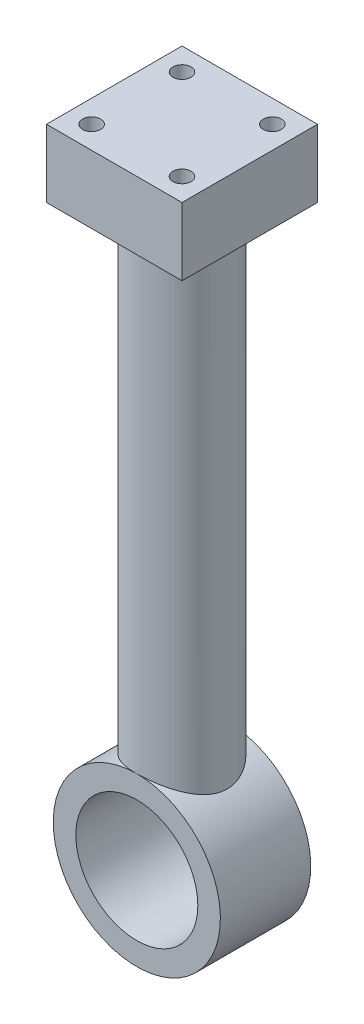
ISO-10303-21;
HEADER;
FILE_DESCRIPTION(('STEP AP214'),'2;1');
FILE_NAME('part.step','',(''),(''),'','','');
FILE_SCHEMA(('AUTOMOTIVE_DESIGN { 1 0 10303 214 1 1 1 1 }'));
ENDSEC;
DATA;
#1=APPLICATION_CONTEXT('core data for automotive mechanical design processes');
#2=APPLICATION_PROTOCOL_DEFINITION('international standard','automotive_design',2000,#1);
#3=PRODUCT_CONTEXT('',#1,'mechanical');
#4=PRODUCT('Part','Part','',(#3));
#5=PRODUCT_RELATED_PRODUCT_CATEGORY('part','',(#4));
#6=PRODUCT_DEFINITION_FORMATION('','',#4);
#7=PRODUCT_DEFINITION_CONTEXT('part definition',#1,'design');
#8=PRODUCT_DEFINITION('design','',#6,#7);
#9=PRODUCT_DEFINITION_SHAPE('','',#8);
#10=(LENGTH_UNIT() NAMED_UNIT(*) SI_UNIT(.MILLI.,.METRE.));
#11=(NAMED_UNIT(*) PLANE_ANGLE_UNIT() SI_UNIT($,.RADIAN.));
#12=(NAMED_UNIT(*) SI_UNIT($,.STERADIAN.) SOLID_ANGLE_UNIT());
#13=UNCERTAINTY_MEASURE_WITH_UNIT(LENGTH_MEASURE(1.E-05),#10,'distance_accuracy_value','');
#14=(GEOMETRIC_REPRESENTATION_CONTEXT(3) GLOBAL_UNCERTAINTY_ASSIGNED_CONTEXT((#13)) GLOBAL_UNIT_ASSIGNED_CONTEXT((#10,
#11,#12)) REPRESENTATION_CONTEXT('',''));
#15=CARTESIAN_POINT('',(0.,0.,0.));
#16=DIRECTION('',(0.,0.,1.));
#17=DIRECTION('',(1.,0.,0.));
#18=AXIS2_PLACEMENT_3D('',#15,#16,#17);
#19=CARTESIAN_POINT('',(-10.,123.,-10.));
#20=DIRECTION('',(0.,1.,0.));
#21=DIRECTION('',(0.,0.,1.));
#22=AXIS2_PLACEMENT_3D('',#19,#20,#21);
#23=CYLINDRICAL_SURFACE('',#22,2.);
#24=CARTESIAN_POINT('',(-10.,138.,-10.));
#25=DIRECTION('',(0.,1.,0.));
#26=DIRECTION('',(0.,0.,1.));
#27=AXIS2_PLACEMENT_3D('',#24,#25,#26);
#28=CIRCLE('',#27,2.);
#29=CARTESIAN_POINT('',(-10.,138.,-8.));
#30=VERTEX_POINT('',#29);
#31=EDGE_CURVE('E512',#30,#30,#28,.T.);
#32=ORIENTED_EDGE('',*,*,#31,.T.);
#33=EDGE_LOOP('',(#32));
#34=FACE_BOUND('',#33,.T.);
#35=CARTESIAN_POINT('',(-10.,124.5,-10.));
#36=DIRECTION('',(0.,-1.,0.));
#37=DIRECTION('',(0.,0.,-1.));
#38=AXIS2_PLACEMENT_3D('',#35,#36,#37);
#39=CIRCLE('',#38,2.);
#40=CARTESIAN_POINT('',(-10.,124.5,-12.));
#41=VERTEX_POINT('',#40);
#42=EDGE_CURVE('E44',#41,#41,#39,.F.);
#43=ORIENTED_EDGE('',*,*,#42,.F.);
#44=EDGE_LOOP('',(#43));
#45=FACE_BOUND('',#44,.T.);
#46=ADVANCED_FACE('F39',(#34,#45),#23,.F.);
#47=CARTESIAN_POINT('',(10.,123.,10.));
#48=DIRECTION('',(0.,1.,0.));
#49=DIRECTION('',(0.,0.,1.));
#50=AXIS2_PLACEMENT_3D('',#47,#48,#49);
#51=CYLINDRICAL_SURFACE('',#50,2.);
#52=CARTESIAN_POINT('',(10.,138.,10.));
#53=DIRECTION('',(0.,1.,0.));
#54=DIRECTION('',(0.,0.,1.));
#55=AXIS2_PLACEMENT_3D('',#52,#53,#54);
#56=CIRCLE('',#55,2.);
#57=CARTESIAN_POINT('',(10.,138.,12.));
#58=VERTEX_POINT('',#57);
#59=EDGE_CURVE('E503',#58,#58,#56,.T.);
#60=ORIENTED_EDGE('',*,*,#59,.T.);
#61=EDGE_LOOP('',(#60));
#62=FACE_BOUND('',#61,.T.);
#63=CARTESIAN_POINT('',(10.,124.5,10.));
#64=DIRECTION('',(0.,-1.,0.));
#65=DIRECTION('',(0.,0.,-1.));
#66=AXIS2_PLACEMENT_3D('',#63,#64,#65);
#67=CIRCLE('',#66,2.);
#68=CARTESIAN_POINT('',(10.,124.5,8.));
#69=VERTEX_POINT('',#68);
#70=EDGE_CURVE('E267',#69,#69,#67,.F.);
#71=ORIENTED_EDGE('',*,*,#70,.F.);
#72=EDGE_LOOP('',(#71));
#73=FACE_BOUND('',#72,.T.);
#74=ADVANCED_FACE('F199',(#62,#73),#51,.F.);
#75=CARTESIAN_POINT('',(-10.,123.,10.));
#76=DIRECTION('',(0.,1.,0.));
#77=DIRECTION('',(0.,0.,1.));
#78=AXIS2_PLACEMENT_3D('',#75,#76,#77);
#79=CYLINDRICAL_SURFACE('',#78,2.);
#80=CARTESIAN_POINT('',(-10.,138.,10.));
#81=DIRECTION('',(0.,1.,0.));
#82=DIRECTION('',(0.,0.,1.));
#83=AXIS2_PLACEMENT_3D('',#80,#81,#82);
#84=CIRCLE('',#83,2.);
#85=CARTESIAN_POINT('',(-10.,138.,12.));
#86=VERTEX_POINT('',#85);
#87=EDGE_CURVE('E507',#86,#86,#84,.T.);
#88=ORIENTED_EDGE('',*,*,#87,.T.);
#89=EDGE_LOOP('',(#88));
#90=FACE_BOUND('',#89,.T.);
#91=CARTESIAN_POINT('',(-10.,124.5,10.));
#92=DIRECTION('',(0.,-1.,0.));
#93=DIRECTION('',(0.,0.,-1.));
#94=AXIS2_PLACEMENT_3D('',#91,#92,#93);
#95=CIRCLE('',#94,2.);
#96=CARTESIAN_POINT('',(-10.,124.5,8.));
#97=VERTEX_POINT('',#96);
#98=EDGE_CURVE('E264',#97,#97,#95,.F.);
#99=ORIENTED_EDGE('',*,*,#98,.F.);
#100=EDGE_LOOP('',(#99));
#101=FACE_BOUND('',#100,.T.);
#102=ADVANCED_FACE('F201',(#90,#101),#79,.F.);
#103=CARTESIAN_POINT('',(10.,123.,-10.));
#104=DIRECTION('',(0.,1.,0.));
#105=DIRECTION('',(0.,0.,1.));
#106=AXIS2_PLACEMENT_3D('',#103,#104,#105);
#107=CYLINDRICAL_SURFACE('',#106,2.);
#108=CARTESIAN_POINT('',(10.,138.,-10.));
#109=DIRECTION('',(0.,1.,0.));
#110=DIRECTION('',(0.,0.,1.));
#111=AXIS2_PLACEMENT_3D('',#108,#109,#110);
#112=CIRCLE('',#111,2.);
#113=CARTESIAN_POINT('',(10.,138.,-8.));
#114=VERTEX_POINT('',#113);
#115=EDGE_CURVE('E508',#114,#114,#112,.T.);
#116=ORIENTED_EDGE('',*,*,#115,.T.);
#117=EDGE_LOOP('',(#116));
#118=FACE_BOUND('',#117,.T.);
#119=CARTESIAN_POINT('',(10.,124.5,-10.));
#120=DIRECTION('',(0.,-1.,0.));
#121=DIRECTION('',(0.,0.,-1.));
#122=AXIS2_PLACEMENT_3D('',#119,#120,#121);
#123=CIRCLE('',#122,2.);
#124=CARTESIAN_POINT('',(10.,124.5,-12.));
#125=VERTEX_POINT('',#124);
#126=EDGE_CURVE('E139',#125,#125,#123,.F.);
#127=ORIENTED_EDGE('',*,*,#126,.F.);
#128=EDGE_LOOP('',(#127));
#129=FACE_BOUND('',#128,.T.);
#130=ADVANCED_FACE('F204',(#118,#129),#107,.F.);
#131=CARTESIAN_POINT('',(0.,0.,10.));
#132=DIRECTION('',(0.,0.,1.));
#133=DIRECTION('',(1.,0.,0.));
#134=AXIS2_PLACEMENT_3D('',#131,#132,#133);
#135=PLANE('',#134);
#136=CARTESIAN_POINT('',(0.,0.,10.));
#137=DIRECTION('',(0.,0.,1.));
#138=DIRECTION('',(1.,0.,0.));
#139=AXIS2_PLACEMENT_3D('',#136,#137,#138);
#140=CIRCLE('',#139,18.5);
#141=CARTESIAN_POINT('',(0.,18.5,10.));
#142=VERTEX_POINT('',#141);
#143=EDGE_CURVE('E50',#142,#142,#140,.T.);
#144=ORIENTED_EDGE('',*,*,#143,.T.);
#145=EDGE_LOOP('',(#144));
#146=FACE_BOUND('',#145,.T.);
#147=CARTESIAN_POINT('',(0.,0.,10.));
#148=DIRECTION('',(0.,0.,1.));
#149=DIRECTION('',(1.,0.,0.));
#150=AXIS2_PLACEMENT_3D('',#147,#148,#149);
#151=CIRCLE('',#150,13.5);
#152=CARTESIAN_POINT('',(13.5,0.,10.));
#153=VERTEX_POINT('',#152);
#154=EDGE_CURVE('E168',#153,#153,#151,.T.);
#155=ORIENTED_EDGE('',*,*,#154,.F.);
#156=EDGE_LOOP('',(#155));
#157=FACE_BOUND('',#156,.T.);
#158=ADVANCED_FACE('F208',(#146,#157),#135,.T.);
#159=CARTESIAN_POINT('',(0.,0.,-10.));
#160=DIRECTION('',(0.,0.,1.));
#161=DIRECTION('',(1.,0.,0.));
#162=AXIS2_PLACEMENT_3D('',#159,#160,#161);
#163=PLANE('',#162);
#164=CARTESIAN_POINT('',(0.,0.,-10.));
#165=DIRECTION('',(0.,0.,1.));
#166=DIRECTION('',(1.,0.,0.));
#167=AXIS2_PLACEMENT_3D('',#164,#165,#166);
#168=CIRCLE('',#167,18.5);
#169=CARTESIAN_POINT('',(0.,18.5,-10.));
#170=VERTEX_POINT('',#169);
#171=EDGE_CURVE('E282',#170,#170,#168,.T.);
#172=ORIENTED_EDGE('',*,*,#171,.F.);
#173=EDGE_LOOP('',(#172));
#174=FACE_BOUND('',#173,.T.);
#175=CARTESIAN_POINT('',(0.,0.,-10.));
#176=DIRECTION('',(0.,0.,1.));
#177=DIRECTION('',(1.,0.,0.));
#178=AXIS2_PLACEMENT_3D('',#175,#176,#177);
#179=CIRCLE('',#178,13.5);
#180=CARTESIAN_POINT('',(13.5,0.,-10.));
#181=VERTEX_POINT('',#180);
#182=EDGE_CURVE('E167',#181,#181,#179,.T.);
#183=ORIENTED_EDGE('',*,*,#182,.T.);
#184=EDGE_LOOP('',(#183));
#185=FACE_BOUND('',#184,.T.);
#186=ADVANCED_FACE('F300',(#174,#185),#163,.F.);
#187=CARTESIAN_POINT('',(0.,0.,10.));
#188=DIRECTION('',(0.,0.,-1.));
#189=DIRECTION('',(-1.,0.,0.));
#190=AXIS2_PLACEMENT_3D('',#187,#188,#189);
#191=CYLINDRICAL_SURFACE('',#190,18.5);
#192=ORIENTED_EDGE('',*,*,#143,.F.);
#193=CARTESIAN_POINT('',(0.,18.5,10.));
#194=CARTESIAN_POINT('',(-0.260345260036934,18.5000015601287,10.0000017936317));
#195=CARTESIAN_POINT('',(-0.520668649806856,18.4944932567609,9.98982321857378));
#196=CARTESIAN_POINT('',(-1.03936465018728,18.4726042232805,9.94924135582138));
#197=CARTESIAN_POINT('',(-1.29773660374058,18.4562199829938,9.91883153855076));
#198=CARTESIAN_POINT('',(-1.81079424837984,18.4129681838879,9.83811751938321));
#199=CARTESIAN_POINT('',(-2.06547476177942,18.386087146962,9.78778773870456));
#200=CARTESIAN_POINT('',(-2.56897335319853,18.3225207082689,9.66785130681143));
#201=CARTESIAN_POINT('',(-2.81779183996168,18.2858359923011,9.59824600397041));
#202=CARTESIAN_POINT('',(-3.3069495931187,18.203717901152,9.44085963271639));
#203=CARTESIAN_POINT('',(-3.54731959226253,18.1583212239932,9.35315469386301));
#204=CARTESIAN_POINT('',(-4.019270466368,18.0597228270742,9.16026516538732));
#205=CARTESIAN_POINT('',(-4.25085121827983,18.0065209980923,9.05508033115658));
#206=CARTESIAN_POINT('',(-4.70398240538946,17.8934922997713,8.82817873352832));
#207=CARTESIAN_POINT('',(-4.92553558398203,17.8336672580692,8.70646652867294));
#208=CARTESIAN_POINT('',(-5.35777503827046,17.7086107029952,8.44735294869647));
#209=CARTESIAN_POINT('',(-5.56845696750648,17.643377053954,8.30994536785632));
#210=CARTESIAN_POINT('',(-5.99176636914993,17.5043319018432,8.01064038203894));
#211=CARTESIAN_POINT('',(-6.20357717708418,17.4302385244163,7.84771868951385));
#212=CARTESIAN_POINT('',(-6.61289705378897,17.2790972268121,7.50604268322373));
#213=CARTESIAN_POINT('',(-6.81040514429198,17.2020491050886,7.32728728833141));
#214=CARTESIAN_POINT('',(-7.19045155060544,17.0466882719994,6.95472979103081));
#215=CARTESIAN_POINT('',(-7.37297867803933,16.9683746668338,6.76091664943895));
#216=CARTESIAN_POINT('',(-7.72215168812883,16.8123452667915,6.35918393071369));
#217=CARTESIAN_POINT('',(-7.88879437034528,16.7346295952754,6.15126152519516));
#218=CARTESIAN_POINT('',(-8.22035510996785,16.5744619490348,5.70183676642702));
#219=CARTESIAN_POINT('',(-8.383615844542,16.4922582678673,5.45901897785336));
#220=CARTESIAN_POINT('',(-8.68887671801992,16.3334937828944,4.95875418728393));
#221=CARTESIAN_POINT('',(-8.83088588800149,16.2569305891671,4.70131346399198));
#222=CARTESIAN_POINT('',(-9.09241907778275,16.1121154131119,4.17309576258943));
#223=CARTESIAN_POINT('',(-9.21195059027867,16.0438606639345,3.90232326660086));
#224=CARTESIAN_POINT('',(-9.42720601668799,15.9183332685632,3.34901047206067));
#225=CARTESIAN_POINT('',(-9.52293298255423,15.8610592147632,3.06647168747931));
#226=CARTESIAN_POINT('',(-9.68399779148641,15.7632011875422,2.5097423286552));
#227=CARTESIAN_POINT('',(-9.75086519920186,15.7217956499164,2.23613979611056));
#228=CARTESIAN_POINT('',(-9.86146866912578,15.6526582935112,1.68257941302374));
#229=CARTESIAN_POINT('',(-9.90520589105562,15.6249257891861,1.40262188184817));
#230=CARTESIAN_POINT('',(-9.96874807055033,15.584463085148,0.839242083734263));
#231=CARTESIAN_POINT('',(-9.98858034182357,15.5717157638329,0.55582414554162));
#232=CARTESIAN_POINT('',(-10.0040227101209,15.5618003128717,-0.0119278186555256));
#233=CARTESIAN_POINT('',(-9.99963589991584,15.5646301940205,-0.296261723056992));
#234=CARTESIAN_POINT('',(-9.96914432373019,15.5841713719157,-0.821556046181394));
#235=CARTESIAN_POINT('',(-9.94630111045772,15.5987974368138,-1.06279291791095));
#236=CARTESIAN_POINT('',(-9.88333601815598,15.6387679515373,-1.54210465157157));
#237=CARTESIAN_POINT('',(-9.84321392431505,15.6641125346156,-1.780179474154));
#238=CARTESIAN_POINT('',(-9.74617853426648,15.7246705430554,-2.25165672224062));
#239=CARTESIAN_POINT('',(-9.68926045103295,15.7598867817946,-2.4850577953999));
#240=CARTESIAN_POINT('',(-9.55926906707594,15.8390706597616,-2.94579033283153));
#241=CARTESIAN_POINT('',(-9.48619478521657,15.8830388304616,-3.1731214275453));
#242=CARTESIAN_POINT('',(-9.32281930937304,15.9794939096601,-3.62548252043396));
#243=CARTESIAN_POINT('',(-9.23217684754413,16.0321458423013,-3.85035392705328));
#244=CARTESIAN_POINT('',(-9.03549081312279,16.1438128573199,-4.29165554615779));
#245=CARTESIAN_POINT('',(-8.92944214632743,16.2028300427574,-4.5080829364059));
#246=CARTESIAN_POINT('',(-8.58930114695173,16.387202989289,-5.14340640291995));
#247=CARTESIAN_POINT('',(-8.33314054862353,16.5199252068163,-5.54854465131019));
#248=CARTESIAN_POINT('',(-7.72425007806683,16.8141769128661,-6.37476972267155));
#249=CARTESIAN_POINT('',(-7.3627682542535,16.9770237249059,-6.78896732712827));
#250=CARTESIAN_POINT('',(-6.77274077927327,17.2170084220645,-7.36243377579658));
#251=CARTESIAN_POINT('',(-6.56790998471968,17.2963523287717,-7.5457481635173));
#252=CARTESIAN_POINT('',(-6.14312583653058,17.4517349339933,-7.89541657239768));
#253=CARTESIAN_POINT('',(-5.92317842718719,17.5277749127259,-8.06177719709785));
#254=CARTESIAN_POINT('',(-5.45477303728387,17.6793614151025,-8.38639977338091));
#255=CARTESIAN_POINT('',(-5.20539176816379,17.7545738201241,-8.54348768103261));
#256=CARTESIAN_POINT('',(-4.69197216716753,17.8971047817229,-8.83587327182804));
#257=CARTESIAN_POINT('',(-4.42793295022079,17.9644228608623,-8.9711696372347));
#258=CARTESIAN_POINT('',(-3.88710409529096,18.0891505971956,-9.21839217812428));
#259=CARTESIAN_POINT('',(-3.61032390588057,18.1465674517075,-9.33033534185022));
#260=CARTESIAN_POINT('',(-3.04592255165521,18.2497837817501,-9.52952635186543));
#261=CARTESIAN_POINT('',(-2.758302877581,18.2955848481371,-9.61677758006274));
#262=CARTESIAN_POINT('',(-2.20135442639347,18.3705100813543,-9.75853022670741));
#263=CARTESIAN_POINT('',(-1.93275381171943,18.4007752144487,-9.81529470465774));
#264=CARTESIAN_POINT('',(-1.39075540009105,18.4496560791214,-9.90662930192207));
#265=CARTESIAN_POINT('',(-1.11735788806292,18.4682725002182,-9.94120073490482));
#266=CARTESIAN_POINT('',(-0.568224103699143,18.4933131448516,-9.98764301913395));
#267=CARTESIAN_POINT('',(-0.29248908483746,18.4997435331607,-9.9995253485573));
#268=CARTESIAN_POINT('',(0.259022759651898,18.5002413317974,-10.00044665159));
#269=CARTESIAN_POINT('',(0.534799581755109,18.4943094877402,-9.98948700288928));
#270=CARTESIAN_POINT('',(1.05817005627003,18.4713922601458,-9.94698990672199));
#271=CARTESIAN_POINT('',(1.30597961298501,18.4554965458375,-9.91748030545676));
#272=CARTESIAN_POINT('',(1.79789820483589,18.4140836320459,-9.84020028952019));
#273=CARTESIAN_POINT('',(2.04200752662438,18.3885671818727,-9.79243129697553));
#274=CARTESIAN_POINT('',(2.524943500587,18.3284991270301,-9.67916232867653));
#275=CARTESIAN_POINT('',(2.76376988551087,18.2939470664009,-9.61366145812064));
#276=CARTESIAN_POINT('',(3.23469600931819,18.2165775382936,-9.46560495622525));
#277=CARTESIAN_POINT('',(3.46679545488744,18.1737597110256,-9.38304858248789));
#278=CARTESIAN_POINT('',(3.92841392997148,18.079666440437,-9.19949460803545));
#279=CARTESIAN_POINT('',(4.15774191613072,18.0282148295362,-9.09810683565546));
#280=CARTESIAN_POINT('',(4.60692133748906,17.9186998935591,-8.87911981608619));
#281=CARTESIAN_POINT('',(4.82676937533345,17.8606342248905,-8.76151481943798));
#282=CARTESIAN_POINT('',(5.47049993749848,17.6782957288492,-8.38572282159317));
#283=CARTESIAN_POINT('',(5.87883009916383,17.5458260935656,-8.10445397039838));
#284=CARTESIAN_POINT('',(6.68942185527784,17.2541892303659,-7.45324461471523));
#285=CARTESIAN_POINT('',(7.08611669836178,17.093687112334,-7.07696527421129));
#286=CARTESIAN_POINT('',(7.63142609127602,16.853813877529,-6.46806011539228));
#287=CARTESIAN_POINT('',(7.8050312239797,16.7739364499795,-6.25748287272956));
#288=CARTESIAN_POINT('',(8.13489416685895,16.6164630462802,-5.82220166458848));
#289=CARTESIAN_POINT('',(8.29114909607492,16.538867450591,-5.59749536268721));
#290=CARTESIAN_POINT('',(8.59591807964794,16.3826621004802,-5.11825729954389));
#291=CARTESIAN_POINT('',(8.74306020908906,16.3043831134723,-4.86274336901801));
#292=CARTESIAN_POINT('',(9.01492681973861,16.1556522637309,-4.3380118566607));
#293=CARTESIAN_POINT('',(9.13966204860927,16.0851966546733,-4.06880092466033));
#294=CARTESIAN_POINT('',(9.36532940418141,15.9548609500687,-3.51837848694815));
#295=CARTESIAN_POINT('',(9.46628312764209,15.894971271765,-3.23717814547656));
#296=CARTESIAN_POINT('',(9.64311799409583,15.7883175217946,-2.66458335309685));
#297=CARTESIAN_POINT('',(9.71900370641373,15.7415510583004,-2.37319077072143));
#298=CARTESIAN_POINT('',(9.83830653095907,15.6672322520124,-1.81160099772398));
#299=CARTESIAN_POINT('',(9.88417044478191,15.6382496771275,-1.54211235959841));
#300=CARTESIAN_POINT('',(9.9537207480768,15.5940744924808,-0.9991615382854));
#301=CARTESIAN_POINT('',(9.97740875810085,15.5788808750637,-0.725699646935386));
#302=CARTESIAN_POINT('',(10.002186238376,15.5629845760352,-0.177507860525426));
#303=CARTESIAN_POINT('',(10.0032901870113,15.5622726104037,0.0972211092079082));
#304=CARTESIAN_POINT('',(9.98291496202552,15.5753509952256,0.645479195470965));
#305=CARTESIAN_POINT('',(9.96143742939178,15.5891402918781,0.919008397736914));
#306=CARTESIAN_POINT('',(9.90046696023898,15.6279189688054,1.42747280694343));
#307=CARTESIAN_POINT('',(9.86363558346974,15.6512464965655,1.66286159096575));
#308=CARTESIAN_POINT('',(9.77355032976157,15.7076586091726,2.12935799855332));
#309=CARTESIAN_POINT('',(9.72029114884589,15.7407463451064,2.36046421383974));
#310=CARTESIAN_POINT('',(9.59794256134696,15.8156451837708,2.81697205520333));
#311=CARTESIAN_POINT('',(9.52885446059316,15.8574555668887,3.04237415014772));
#312=CARTESIAN_POINT('',(9.37550230343087,15.9486019589403,3.48643090009294));
#313=CARTESIAN_POINT('',(9.29123221983156,15.9979409555108,3.70508283477648));
#314=CARTESIAN_POINT('',(9.00516892242065,16.1619073604124,4.37640710878437));
#315=CARTESIAN_POINT('',(8.77777780095711,16.2875641204245,4.81575959436667));
#316=CARTESIAN_POINT('',(8.26352679837469,16.5543897998624,5.65295273960405));
#317=CARTESIAN_POINT('',(7.97663500608062,16.6955670239934,6.05077095092242));
#318=CARTESIAN_POINT('',(7.48225445720441,16.9205598959603,6.64039631251608));
#319=CARTESIAN_POINT('',(7.29275761091655,17.0032851615063,6.84796779477154));
#320=CARTESIAN_POINT('',(6.89677439375489,17.1677139681522,7.24661206802323));
#321=CARTESIAN_POINT('',(6.69029289534964,17.2494177945825,7.43768955871657));
#322=CARTESIAN_POINT('',(6.26108892799167,17.4098047719369,7.80244524805648));
#323=CARTESIAN_POINT('',(6.03835332705936,17.488485400248,7.97610910290273));
#324=CARTESIAN_POINT('',(5.57778336633266,17.6407811494536,8.30471914136325));
#325=CARTESIAN_POINT('',(5.33994720597422,17.7143956640846,8.45966308643021));
#326=CARTESIAN_POINT('',(4.84329364112703,17.8566833108657,8.75375241595587));
#327=CARTESIAN_POINT('',(4.58406776860863,17.9251511918902,8.89230922336522));
#328=CARTESIAN_POINT('',(4.05264358426755,18.0527200214324,9.14673778694339));
#329=CARTESIAN_POINT('',(3.78045173359373,18.1118255731273,9.26262069782278));
#330=CARTESIAN_POINT('',(3.22546667112318,18.2188378902588,9.47016093500913));
#331=CARTESIAN_POINT('',(2.94269560879305,18.2667666836179,9.56186596017019));
#332=CARTESIAN_POINT('',(2.36851286184827,18.3500472770741,9.72001840378214));
#333=CARTESIAN_POINT('',(2.07710594670966,18.3854058842884,9.78647949388819));
#334=CARTESIAN_POINT('',(1.48961294667094,18.4422809611325,9.89291374915401));
#335=CARTESIAN_POINT('',(1.19355607963857,18.4638631375107,9.93301267661729));
#336=CARTESIAN_POINT('',(0.598323188696899,18.4927217790205,9.98655480584988));
#337=CARTESIAN_POINT('',(0.299147156765303,18.4999982073495,9.99999793904513));
#338=CARTESIAN_POINT('',(0.,18.5,10.));
#339=B_SPLINE_CURVE_WITH_KNOTS('',3,(#193,#194,#195,#196,#197,#198,#199,#200,#201,#202,#203,
#204,#205,#206,#207,#208,#209,#210,#211,#212,#213,#214,#215,#216,#217,#218,#219,#220,#221,#222,
#223,#224,#225,#226,#227,#228,#229,#230,#231,#232,#233,#234,#235,#236,#237,#238,#239,#240,#241,
#242,#243,#244,#245,#246,#247,#248,#249,#250,#251,#252,#253,#254,#255,#256,#257,#258,#259,#260,
#261,#262,#263,#264,#265,#266,#267,#268,#269,#270,#271,#272,#273,#274,#275,#276,#277,#278,#279,
#280,#281,#282,#283,#284,#285,#286,#287,#288,#289,#290,#291,#292,#293,#294,#295,#296,#297,#298,
#299,#300,#301,#302,#303,#304,#305,#306,#307,#308,#309,#310,#311,#312,#313,#314,#315,#316,#317,
#318,#319,#320,#321,#322,#323,#324,#325,#326,#327,#328,#329,#330,#331,#332,#333,#334,#335,#336,
#337,#338),.UNSPECIFIED.,.T.,.F.,(4,2,2,2,2,2,2,2,2,2,2,2,2,2,2,2,2,2,2,2,2,2,2,2,2,2,2,2,2,2,2,
2,2,2,2,2,2,2,2,2,2,2,2,2,2,2,2,2,2,2,2,2,2,2,2,2,2,2,2,2,2,2,2,2,2,2,2,2,2,2,2,2,4),(0.,
0.780742808011476,1.56173772087664,2.34373876259691,3.12568511510013,3.90440718381067,
4.68314015064255,5.46165876373511,6.2404862640498,7.0715326640242,7.90263585176246,
8.73435419678228,9.56623976591362,10.4768932588492,11.387158654218,12.2971200820058,
13.2069647844932,14.0597376192508,14.9124676928874,15.7642225138773,16.6158685684953,
17.343277173456,18.0706948218477,18.798319992154,19.5259893619264,20.2695451963684,
21.0133474563477,22.5003029142654,24.2126238912848,25.0701911019172,25.9274230005843,
26.8387649260678,27.7501619398289,28.6608936296874,29.5715005215884,30.3989527014886,
31.2263558976492,32.0533404082937,32.8802750416759,33.629598602871,34.3788638151346,
35.128166844526,35.8775024967149,36.6445708810751,37.4119119151403,38.9457426418521,
40.6476283953485,41.4999961479204,42.3525052231245,43.2665232958839,44.1801017745154,
45.0928473765671,46.0054265140598,46.8288999146293,47.6523131334052,48.4751984548052,
49.2980239815856,50.015398377986,50.7330046329425,51.4505517092446,52.168384279325,
53.6933927592879,55.2192212509038,56.0973306566379,56.9751890276237,57.8537646602769,
58.732445250198,59.6366115099095,60.5403318289385,61.4422556897116,62.3436903861053,
63.2407929118342,64.137897745425),.UNSPECIFIED.);
#340=EDGE_CURVE('E11',#142,#170,#339,.T.);
#341=ORIENTED_EDGE('',*,*,#340,.T.);
#342=ORIENTED_EDGE('',*,*,#171,.T.);
#343=CARTESIAN_POINT('',(0.,18.5,10.));
#344=CARTESIAN_POINT('',(0.260345260036934,18.5000015601287,10.0000017936317));
#345=CARTESIAN_POINT('',(0.520668649806856,18.4944932567609,9.98982321857378));
#346=CARTESIAN_POINT('',(1.03936465018728,18.4726042232805,9.94924135582138));
#347=CARTESIAN_POINT('',(1.29773660374058,18.4562199829938,9.91883153855076));
#348=CARTESIAN_POINT('',(1.81079424837984,18.4129681838879,9.83811751938321));
#349=CARTESIAN_POINT('',(2.06547476177942,18.386087146962,9.78778773870456));
#350=CARTESIAN_POINT('',(2.56897335319853,18.3225207082689,9.66785130681143));
#351=CARTESIAN_POINT('',(2.81779183996168,18.2858359923011,9.59824600397041));
#352=CARTESIAN_POINT('',(3.3069495931187,18.203717901152,9.44085963271639));
#353=CARTESIAN_POINT('',(3.54731959226253,18.1583212239932,9.35315469386301));
#354=CARTESIAN_POINT('',(4.019270466368,18.0597228270742,9.16026516538732));
#355=CARTESIAN_POINT('',(4.25085121827983,18.0065209980923,9.05508033115658));
#356=CARTESIAN_POINT('',(4.70398240538946,17.8934922997713,8.82817873352832));
#357=CARTESIAN_POINT('',(4.92553558398203,17.8336672580692,8.70646652867294));
#358=CARTESIAN_POINT('',(5.35777503827046,17.7086107029952,8.44735294869647));
#359=CARTESIAN_POINT('',(5.56845696750648,17.643377053954,8.30994536785632));
#360=CARTESIAN_POINT('',(5.99176636914993,17.5043319018432,8.01064038203894));
#361=CARTESIAN_POINT('',(6.20357717708418,17.4302385244163,7.84771868951385));
#362=CARTESIAN_POINT('',(6.61289705378897,17.2790972268121,7.50604268322373));
#363=CARTESIAN_POINT('',(6.81040514429198,17.2020491050886,7.32728728833141));
#364=CARTESIAN_POINT('',(7.19045155060544,17.0466882719994,6.95472979103081));
#365=CARTESIAN_POINT('',(7.37297867803933,16.9683746668338,6.76091664943895));
#366=CARTESIAN_POINT('',(7.72215168812883,16.8123452667915,6.35918393071369));
#367=CARTESIAN_POINT('',(7.88879437034528,16.7346295952754,6.15126152519516));
#368=CARTESIAN_POINT('',(8.22035510996785,16.5744619490348,5.70183676642702));
#369=CARTESIAN_POINT('',(8.383615844542,16.4922582678673,5.45901897785336));
#370=CARTESIAN_POINT('',(8.68887671801992,16.3334937828944,4.95875418728393));
#371=CARTESIAN_POINT('',(8.83088588800149,16.2569305891671,4.70131346399198));
#372=CARTESIAN_POINT('',(9.09241907778275,16.1121154131119,4.17309576258943));
#373=CARTESIAN_POINT('',(9.21195059027867,16.0438606639345,3.90232326660086));
#374=CARTESIAN_POINT('',(9.42720601668799,15.9183332685632,3.34901047206067));
#375=CARTESIAN_POINT('',(9.52293298255423,15.8610592147632,3.06647168747931));
#376=CARTESIAN_POINT('',(9.68399779148641,15.7632011875422,2.5097423286552));
#377=CARTESIAN_POINT('',(9.75086519920186,15.7217956499164,2.23613979611056));
#378=CARTESIAN_POINT('',(9.86146866912578,15.6526582935112,1.68257941302374));
#379=CARTESIAN_POINT('',(9.90520589105562,15.6249257891861,1.40262188184817));
#380=CARTESIAN_POINT('',(9.96874807055033,15.584463085148,0.839242083734263));
#381=CARTESIAN_POINT('',(9.98858034182357,15.5717157638329,0.55582414554162));
#382=CARTESIAN_POINT('',(10.0040227101209,15.5618003128717,-0.0119278186555256));
#383=CARTESIAN_POINT('',(9.99963589991584,15.5646301940205,-0.296261723056992));
#384=CARTESIAN_POINT('',(9.96914432373019,15.5841713719157,-0.821556046181394));
#385=CARTESIAN_POINT('',(9.94630111045772,15.5987974368138,-1.06279291791095));
#386=CARTESIAN_POINT('',(9.88333601815598,15.6387679515373,-1.54210465157157));
#387=CARTESIAN_POINT('',(9.84321392431505,15.6641125346156,-1.780179474154));
#388=CARTESIAN_POINT('',(9.74617853426648,15.7246705430554,-2.25165672224062));
#389=CARTESIAN_POINT('',(9.68926045103295,15.7598867817946,-2.4850577953999));
#390=CARTESIAN_POINT('',(9.55926906707594,15.8390706597616,-2.94579033283153));
#391=CARTESIAN_POINT('',(9.48619478521657,15.8830388304616,-3.1731214275453));
#392=CARTESIAN_POINT('',(9.32281930937304,15.9794939096601,-3.62548252043396));
#393=CARTESIAN_POINT('',(9.23217684754413,16.0321458423013,-3.85035392705328));
#394=CARTESIAN_POINT('',(9.03549081312279,16.1438128573199,-4.29165554615779));
#395=CARTESIAN_POINT('',(8.92944214632743,16.2028300427574,-4.5080829364059));
#396=CARTESIAN_POINT('',(8.58930114695173,16.387202989289,-5.14340640291995));
#397=CARTESIAN_POINT('',(8.33314054862353,16.5199252068163,-5.54854465131019));
#398=CARTESIAN_POINT('',(7.72425007806683,16.8141769128661,-6.37476972267155));
#399=CARTESIAN_POINT('',(7.3627682542535,16.9770237249059,-6.78896732712827));
#400=CARTESIAN_POINT('',(6.77274077927327,17.2170084220645,-7.36243377579658));
#401=CARTESIAN_POINT('',(6.56790998471968,17.2963523287717,-7.5457481635173));
#402=CARTESIAN_POINT('',(6.14312583653058,17.4517349339933,-7.89541657239768));
#403=CARTESIAN_POINT('',(5.92317842718719,17.5277749127259,-8.06177719709785));
#404=CARTESIAN_POINT('',(5.45477303728387,17.6793614151025,-8.38639977338091));
#405=CARTESIAN_POINT('',(5.20539176816379,17.7545738201241,-8.54348768103261));
#406=CARTESIAN_POINT('',(4.69197216716753,17.8971047817229,-8.83587327182804));
#407=CARTESIAN_POINT('',(4.42793295022079,17.9644228608623,-8.9711696372347));
#408=CARTESIAN_POINT('',(3.88710409529096,18.0891505971956,-9.21839217812428));
#409=CARTESIAN_POINT('',(3.61032390588057,18.1465674517075,-9.33033534185022));
#410=CARTESIAN_POINT('',(3.04592255165521,18.2497837817501,-9.52952635186543));
#411=CARTESIAN_POINT('',(2.758302877581,18.2955848481371,-9.61677758006274));
#412=CARTESIAN_POINT('',(2.20135442639347,18.3705100813543,-9.75853022670741));
#413=CARTESIAN_POINT('',(1.93275381171943,18.4007752144487,-9.81529470465774));
#414=CARTESIAN_POINT('',(1.39075540009105,18.4496560791214,-9.90662930192207));
#415=CARTESIAN_POINT('',(1.11735788806292,18.4682725002182,-9.94120073490482));
#416=CARTESIAN_POINT('',(0.568224103699143,18.4933131448516,-9.98764301913395));
#417=CARTESIAN_POINT('',(0.29248908483746,18.4997435331607,-9.9995253485573));
#418=CARTESIAN_POINT('',(-0.259022759651898,18.5002413317974,-10.00044665159));
#419=CARTESIAN_POINT('',(-0.534799581755109,18.4943094877402,-9.98948700288928));
#420=CARTESIAN_POINT('',(-1.05817005627003,18.4713922601458,-9.94698990672199));
#421=CARTESIAN_POINT('',(-1.30597961298501,18.4554965458375,-9.91748030545676));
#422=CARTESIAN_POINT('',(-1.79789820483589,18.4140836320459,-9.84020028952019));
#423=CARTESIAN_POINT('',(-2.04200752662438,18.3885671818727,-9.79243129697553));
#424=CARTESIAN_POINT('',(-2.524943500587,18.3284991270301,-9.67916232867653));
#425=CARTESIAN_POINT('',(-2.76376988551087,18.2939470664009,-9.61366145812064));
#426=CARTESIAN_POINT('',(-3.23469600931819,18.2165775382936,-9.46560495622525));
#427=CARTESIAN_POINT('',(-3.46679545488744,18.1737597110256,-9.38304858248789));
#428=CARTESIAN_POINT('',(-3.92841392997148,18.079666440437,-9.19949460803545));
#429=CARTESIAN_POINT('',(-4.15774191613072,18.0282148295362,-9.09810683565546));
#430=CARTESIAN_POINT('',(-4.60692133748906,17.9186998935591,-8.87911981608619));
#431=CARTESIAN_POINT('',(-4.82676937533345,17.8606342248905,-8.76151481943798));
#432=CARTESIAN_POINT('',(-5.47049993749848,17.6782957288492,-8.38572282159317));
#433=CARTESIAN_POINT('',(-5.87883009916383,17.5458260935656,-8.10445397039838));
#434=CARTESIAN_POINT('',(-6.68942185527784,17.2541892303659,-7.45324461471523));
#435=CARTESIAN_POINT('',(-7.08611669836178,17.093687112334,-7.07696527421129));
#436=CARTESIAN_POINT('',(-7.63142609127602,16.853813877529,-6.46806011539228));
#437=CARTESIAN_POINT('',(-7.8050312239797,16.7739364499795,-6.25748287272956));
#438=CARTESIAN_POINT('',(-8.13489416685895,16.6164630462802,-5.82220166458848));
#439=CARTESIAN_POINT('',(-8.29114909607492,16.538867450591,-5.59749536268721));
#440=CARTESIAN_POINT('',(-8.59591807964794,16.3826621004802,-5.11825729954389));
#441=CARTESIAN_POINT('',(-8.74306020908906,16.3043831134723,-4.86274336901801));
#442=CARTESIAN_POINT('',(-9.01492681973861,16.1556522637309,-4.3380118566607));
#443=CARTESIAN_POINT('',(-9.13966204860927,16.0851966546733,-4.06880092466033));
#444=CARTESIAN_POINT('',(-9.36532940418141,15.9548609500687,-3.51837848694815));
#445=CARTESIAN_POINT('',(-9.46628312764209,15.894971271765,-3.23717814547656));
#446=CARTESIAN_POINT('',(-9.64311799409583,15.7883175217946,-2.66458335309685));
#447=CARTESIAN_POINT('',(-9.71900370641373,15.7415510583004,-2.37319077072143));
#448=CARTESIAN_POINT('',(-9.83830653095907,15.6672322520124,-1.81160099772398));
#449=CARTESIAN_POINT('',(-9.88417044478191,15.6382496771275,-1.54211235959841));
#450=CARTESIAN_POINT('',(-9.9537207480768,15.5940744924808,-0.9991615382854));
#451=CARTESIAN_POINT('',(-9.97740875810085,15.5788808750637,-0.725699646935386));
#452=CARTESIAN_POINT('',(-10.002186238376,15.5629845760352,-0.177507860525426));
#453=CARTESIAN_POINT('',(-10.0032901870113,15.5622726104037,0.0972211092079082));
#454=CARTESIAN_POINT('',(-9.98291496202552,15.5753509952256,0.645479195470965));
#455=CARTESIAN_POINT('',(-9.96143742939178,15.5891402918781,0.919008397736914));
#456=CARTESIAN_POINT('',(-9.90046696023898,15.6279189688054,1.42747280694343));
#457=CARTESIAN_POINT('',(-9.86363558346974,15.6512464965655,1.66286159096575));
#458=CARTESIAN_POINT('',(-9.77355032976157,15.7076586091726,2.12935799855332));
#459=CARTESIAN_POINT('',(-9.72029114884589,15.7407463451064,2.36046421383974));
#460=CARTESIAN_POINT('',(-9.59794256134696,15.8156451837708,2.81697205520333));
#461=CARTESIAN_POINT('',(-9.52885446059316,15.8574555668887,3.04237415014772));
#462=CARTESIAN_POINT('',(-9.37550230343087,15.9486019589403,3.48643090009294));
#463=CARTESIAN_POINT('',(-9.29123221983156,15.9979409555108,3.70508283477648));
#464=CARTESIAN_POINT('',(-9.00516892242065,16.1619073604124,4.37640710878437));
#465=CARTESIAN_POINT('',(-8.77777780095711,16.2875641204245,4.81575959436667));
#466=CARTESIAN_POINT('',(-8.26352679837469,16.5543897998624,5.65295273960405));
#467=CARTESIAN_POINT('',(-7.97663500608062,16.6955670239934,6.05077095092242));
#468=CARTESIAN_POINT('',(-7.48225445720441,16.9205598959603,6.64039631251608));
#469=CARTESIAN_POINT('',(-7.29275761091655,17.0032851615063,6.84796779477154));
#470=CARTESIAN_POINT('',(-6.89677439375489,17.1677139681522,7.24661206802323));
#471=CARTESIAN_POINT('',(-6.69029289534964,17.2494177945825,7.43768955871657));
#472=CARTESIAN_POINT('',(-6.26108892799167,17.4098047719369,7.80244524805648));
#473=CARTESIAN_POINT('',(-6.03835332705936,17.488485400248,7.97610910290273));
#474=CARTESIAN_POINT('',(-5.57778336633266,17.6407811494536,8.30471914136325));
#475=CARTESIAN_POINT('',(-5.33994720597422,17.7143956640846,8.45966308643021));
#476=CARTESIAN_POINT('',(-4.84329364112703,17.8566833108657,8.75375241595587));
#477=CARTESIAN_POINT('',(-4.58406776860863,17.9251511918902,8.89230922336522));
#478=CARTESIAN_POINT('',(-4.05264358426755,18.0527200214324,9.14673778694339));
#479=CARTESIAN_POINT('',(-3.78045173359373,18.1118255731273,9.26262069782278));
#480=CARTESIAN_POINT('',(-3.22546667112318,18.2188378902588,9.47016093500913));
#481=CARTESIAN_POINT('',(-2.94269560879305,18.2667666836179,9.56186596017019));
#482=CARTESIAN_POINT('',(-2.36851286184827,18.3500472770741,9.72001840378214));
#483=CARTESIAN_POINT('',(-2.07710594670966,18.3854058842884,9.78647949388819));
#484=CARTESIAN_POINT('',(-1.48961294667094,18.4422809611325,9.89291374915401));
#485=CARTESIAN_POINT('',(-1.19355607963857,18.4638631375107,9.93301267661729));
#486=CARTESIAN_POINT('',(-0.598323188696899,18.4927217790205,9.98655480584988));
#487=CARTESIAN_POINT('',(-0.299147156765303,18.4999982073495,9.99999793904513));
#488=CARTESIAN_POINT('',(0.,18.5,10.));
#489=B_SPLINE_CURVE_WITH_KNOTS('',3,(#343,#344,#345,#346,#347,#348,#349,#350,#351,#352,#353,
#354,#355,#356,#357,#358,#359,#360,#361,#362,#363,#364,#365,#366,#367,#368,#369,#370,#371,#372,
#373,#374,#375,#376,#377,#378,#379,#380,#381,#382,#383,#384,#385,#386,#387,#388,#389,#390,#391,
#392,#393,#394,#395,#396,#397,#398,#399,#400,#401,#402,#403,#404,#405,#406,#407,#408,#409,#410,
#411,#412,#413,#414,#415,#416,#417,#418,#419,#420,#421,#422,#423,#424,#425,#426,#427,#428,#429,
#430,#431,#432,#433,#434,#435,#436,#437,#438,#439,#440,#441,#442,#443,#444,#445,#446,#447,#448,
#449,#450,#451,#452,#453,#454,#455,#456,#457,#458,#459,#460,#461,#462,#463,#464,#465,#466,#467,
#468,#469,#470,#471,#472,#473,#474,#475,#476,#477,#478,#479,#480,#481,#482,#483,#484,#485,#486,
#487,#488),.UNSPECIFIED.,.T.,.F.,(4,2,2,2,2,2,2,2,2,2,2,2,2,2,2,2,2,2,2,2,2,2,2,2,2,2,2,2,2,2,2,
2,2,2,2,2,2,2,2,2,2,2,2,2,2,2,2,2,2,2,2,2,2,2,2,2,2,2,2,2,2,2,2,2,2,2,2,2,2,2,2,2,4),(0.,
0.780742808011476,1.56173772087664,2.34373876259691,3.12568511510013,3.90440718381067,
4.68314015064255,5.46165876373511,6.2404862640498,7.0715326640242,7.90263585176246,
8.73435419678228,9.56623976591362,10.4768932588492,11.387158654218,12.2971200820058,
13.2069647844932,14.0597376192508,14.9124676928874,15.7642225138773,16.6158685684953,
17.343277173456,18.0706948218477,18.798319992154,19.5259893619264,20.2695451963684,
21.0133474563477,22.5003029142654,24.2126238912848,25.0701911019172,25.9274230005843,
26.8387649260678,27.7501619398289,28.6608936296874,29.5715005215884,30.3989527014886,
31.2263558976492,32.0533404082937,32.8802750416759,33.629598602871,34.3788638151346,
35.128166844526,35.8775024967149,36.6445708810751,37.4119119151403,38.9457426418521,
40.6476283953485,41.4999961479204,42.3525052231245,43.2665232958839,44.1801017745154,
45.0928473765671,46.0054265140598,46.8288999146293,47.6523131334052,48.4751984548052,
49.2980239815856,50.015398377986,50.7330046329425,51.4505517092446,52.168384279325,
53.6933927592879,55.2192212509038,56.0973306566379,56.9751890276237,57.8537646602769,
58.732445250198,59.6366115099095,60.5403318289385,61.4422556897116,62.3436903861053,
63.2407929118342,64.137897745425),.UNSPECIFIED.);
#490=EDGE_CURVE('E153',#142,#170,#489,.T.);
#491=ORIENTED_EDGE('',*,*,#490,.F.);
#492=EDGE_LOOP('',(#192,#341,#342,#491));
#493=FACE_BOUND('',#492,.T.);
#494=ADVANCED_FACE('F41',(#493),#191,.T.);
#495=CARTESIAN_POINT('',(0.,0.,10.));
#496=DIRECTION('',(0.,0.,-1.));
#497=DIRECTION('',(-1.,0.,0.));
#498=AXIS2_PLACEMENT_3D('',#495,#496,#497);
#499=CYLINDRICAL_SURFACE('',#498,13.5);
#500=ORIENTED_EDGE('',*,*,#154,.T.);
#501=EDGE_LOOP('',(#500));
#502=FACE_BOUND('',#501,.T.);
#503=ORIENTED_EDGE('',*,*,#182,.F.);
#504=EDGE_LOOP('',(#503));
#505=FACE_BOUND('',#504,.T.);
#506=ADVANCED_FACE('F296',(#502,#505),#499,.F.);
#507=CARTESIAN_POINT('',(0.,-18.501,0.));
#508=DIRECTION('',(0.,1.,0.));
#509=DIRECTION('',(0.,0.,1.));
#510=AXIS2_PLACEMENT_3D('',#507,#508,#509);
#511=CYLINDRICAL_SURFACE('',#510,10.);
#512=CARTESIAN_POINT('',(0.,123.,0.));
#513=DIRECTION('',(0.,1.,0.));
#514=DIRECTION('',(0.,0.,1.));
#515=AXIS2_PLACEMENT_3D('',#512,#513,#514);
#516=CIRCLE('',#515,10.);
#517=CARTESIAN_POINT('',(5.95093604847269,123.,8.0365639515273));
#518=VERTEX_POINT('',#517);
#519=CARTESIAN_POINT('',(8.03656395152731,123.,5.95093604847269));
#520=VERTEX_POINT('',#519);
#521=EDGE_CURVE('E148',#518,#520,#516,.T.);
#522=ORIENTED_EDGE('',*,*,#521,.F.);
#523=CARTESIAN_POINT('',(-5.95093604847269,123.,8.03656395152731));
#524=VERTEX_POINT('',#523);
#525=EDGE_CURVE('E154',#524,#518,#516,.T.);
#526=ORIENTED_EDGE('',*,*,#525,.F.);
#527=CARTESIAN_POINT('',(0.,123.,0.));
#528=DIRECTION('',(0.,-1.,0.));
#529=DIRECTION('',(0.,0.,-1.));
#530=AXIS2_PLACEMENT_3D('',#527,#528,#529);
#531=CIRCLE('',#530,10.);
#532=CARTESIAN_POINT('',(-8.0365639515273,123.,5.95093604847269));
#533=VERTEX_POINT('',#532);
#534=EDGE_CURVE('E268',#533,#524,#531,.F.);
#535=ORIENTED_EDGE('',*,*,#534,.F.);
#536=CARTESIAN_POINT('',(-8.03656395152731,123.,-5.95093604847269));
#537=VERTEX_POINT('',#536);
#538=EDGE_CURVE('E155',#537,#533,#516,.T.);
#539=ORIENTED_EDGE('',*,*,#538,.F.);
#540=CARTESIAN_POINT('',(0.,123.,0.));
#541=DIRECTION('',(0.,-1.,0.));
#542=DIRECTION('',(0.,0.,-1.));
#543=AXIS2_PLACEMENT_3D('',#540,#541,#542);
#544=CIRCLE('',#543,10.);
#545=CARTESIAN_POINT('',(-5.95093604847269,123.,-8.0365639515273));
#546=VERTEX_POINT('',#545);
#547=EDGE_CURVE('E273',#546,#537,#544,.F.);
#548=ORIENTED_EDGE('',*,*,#547,.F.);
#549=CARTESIAN_POINT('',(5.95093604847269,123.,-8.03656395152731));
#550=VERTEX_POINT('',#549);
#551=EDGE_CURVE('E137',#550,#546,#516,.T.);
#552=ORIENTED_EDGE('',*,*,#551,.F.);
#553=CARTESIAN_POINT('',(0.,123.,0.));
#554=DIRECTION('',(0.,-1.,0.));
#555=DIRECTION('',(0.,0.,-1.));
#556=AXIS2_PLACEMENT_3D('',#553,#554,#555);
#557=CIRCLE('',#556,10.);
#558=CARTESIAN_POINT('',(8.0365639515273,123.,-5.95093604847269));
#559=VERTEX_POINT('',#558);
#560=EDGE_CURVE('E127',#559,#550,#557,.F.);
#561=ORIENTED_EDGE('',*,*,#560,.F.);
#562=EDGE_CURVE('E135',#520,#559,#516,.T.);
#563=ORIENTED_EDGE('',*,*,#562,.F.);
#564=EDGE_LOOP('',(#522,#526,#535,#539,#548,#552,#561,#563));
#565=FACE_BOUND('',#564,.T.);
#566=ORIENTED_EDGE('',*,*,#490,.T.);
#567=ORIENTED_EDGE('',*,*,#340,.F.);
#568=EDGE_LOOP('',(#566,#567));
#569=FACE_BOUND('',#568,.T.);
#570=ADVANCED_FACE('F133',(#565,#569),#511,.T.);
#571=CARTESIAN_POINT('',(15.,138.,-15.));
#572=DIRECTION('',(-1.,0.,0.));
#573=DIRECTION('',(0.,0.,1.));
#574=AXIS2_PLACEMENT_3D('',#571,#572,#573);
#575=PLANE('',#574);
#576=DIRECTION('',(0.,0.,-1.));
#577=VECTOR('',#576,1.);
#578=CARTESIAN_POINT('',(15.,123.,-15.));
#579=LINE('',#578,#577);
#580=CARTESIAN_POINT('',(15.,123.,15.));
#581=VERTEX_POINT('',#580);
#582=CARTESIAN_POINT('',(15.,123.,-15.));
#583=VERTEX_POINT('',#582);
#584=EDGE_CURVE('E519',#581,#583,#579,.T.);
#585=ORIENTED_EDGE('',*,*,#584,.T.);
#586=DIRECTION('',(0.,-1.,0.));
#587=VECTOR('',#586,1.);
#588=CARTESIAN_POINT('',(15.,138.,-15.));
#589=LINE('',#588,#587);
#590=CARTESIAN_POINT('',(15.,138.,-15.));
#591=VERTEX_POINT('',#590);
#592=EDGE_CURVE('E158',#591,#583,#589,.T.);
#593=ORIENTED_EDGE('',*,*,#592,.F.);
#594=DIRECTION('',(0.,0.,-1.));
#595=VECTOR('',#594,1.);
#596=CARTESIAN_POINT('',(15.,138.,-15.));
#597=LINE('',#596,#595);
#598=CARTESIAN_POINT('',(15.,138.,15.));
#599=VERTEX_POINT('',#598);
#600=EDGE_CURVE('E520',#599,#591,#597,.T.);
#601=ORIENTED_EDGE('',*,*,#600,.F.);
#602=DIRECTION('',(0.,-1.,0.));
#603=VECTOR('',#602,1.);
#604=CARTESIAN_POINT('',(15.,138.,15.));
#605=LINE('',#604,#603);
#606=EDGE_CURVE('E534',#599,#581,#605,.T.);
#607=ORIENTED_EDGE('',*,*,#606,.T.);
#608=EDGE_LOOP('',(#585,#593,#601,#607));
#609=FACE_BOUND('',#608,.T.);
#610=ADVANCED_FACE('F174',(#609),#575,.F.);
#611=CARTESIAN_POINT('',(-15.,138.,-15.));
#612=DIRECTION('',(0.,0.,1.));
#613=DIRECTION('',(1.,0.,0.));
#614=AXIS2_PLACEMENT_3D('',#611,#612,#613);
#615=PLANE('',#614);
#616=DIRECTION('',(-1.,0.,0.));
#617=VECTOR('',#616,1.);
#618=CARTESIAN_POINT('',(-15.,123.,-15.));
#619=LINE('',#618,#617);
#620=CARTESIAN_POINT('',(-15.,123.,-15.));
#621=VERTEX_POINT('',#620);
#622=EDGE_CURVE('E538',#583,#621,#619,.T.);
#623=ORIENTED_EDGE('',*,*,#622,.T.);
#624=DIRECTION('',(0.,-1.,0.));
#625=VECTOR('',#624,1.);
#626=CARTESIAN_POINT('',(-15.,138.,-15.));
#627=LINE('',#626,#625);
#628=CARTESIAN_POINT('',(-15.,138.,-15.));
#629=VERTEX_POINT('',#628);
#630=EDGE_CURVE('E552',#629,#621,#627,.T.);
#631=ORIENTED_EDGE('',*,*,#630,.F.);
#632=DIRECTION('',(-1.,0.,0.));
#633=VECTOR('',#632,1.);
#634=CARTESIAN_POINT('',(-15.,138.,-15.));
#635=LINE('',#634,#633);
#636=EDGE_CURVE('E524',#591,#629,#635,.T.);
#637=ORIENTED_EDGE('',*,*,#636,.F.);
#638=ORIENTED_EDGE('',*,*,#592,.T.);
#639=EDGE_LOOP('',(#623,#631,#637,#638));
#640=FACE_BOUND('',#639,.T.);
#641=ADVANCED_FACE('F177',(#640),#615,.F.);
#642=CARTESIAN_POINT('',(-15.,138.,-15.));
#643=DIRECTION('',(1.,0.,0.));
#644=DIRECTION('',(0.,0.,-1.));
#645=AXIS2_PLACEMENT_3D('',#642,#643,#644);
#646=PLANE('',#645);
#647=DIRECTION('',(0.,0.,1.));
#648=VECTOR('',#647,1.);
#649=CARTESIAN_POINT('',(-15.,123.,-15.));
#650=LINE('',#649,#648);
#651=CARTESIAN_POINT('',(-15.,123.,15.));
#652=VERTEX_POINT('',#651);
#653=EDGE_CURVE('E541',#621,#652,#650,.T.);
#654=ORIENTED_EDGE('',*,*,#653,.T.);
#655=DIRECTION('',(0.,-1.,0.));
#656=VECTOR('',#655,1.);
#657=CARTESIAN_POINT('',(-15.,138.,15.));
#658=LINE('',#657,#656);
#659=CARTESIAN_POINT('',(-15.,138.,15.));
#660=VERTEX_POINT('',#659);
#661=EDGE_CURVE('E549',#660,#652,#658,.T.);
#662=ORIENTED_EDGE('',*,*,#661,.F.);
#663=DIRECTION('',(0.,0.,1.));
#664=VECTOR('',#663,1.);
#665=CARTESIAN_POINT('',(-15.,138.,-15.));
#666=LINE('',#665,#664);
#667=EDGE_CURVE('E528',#629,#660,#666,.T.);
#668=ORIENTED_EDGE('',*,*,#667,.F.);
#669=ORIENTED_EDGE('',*,*,#630,.T.);
#670=EDGE_LOOP('',(#654,#662,#668,#669));
#671=FACE_BOUND('',#670,.T.);
#672=ADVANCED_FACE('F181',(#671),#646,.F.);
#673=CARTESIAN_POINT('',(-15.,138.,15.));
#674=DIRECTION('',(0.,0.,-1.));
#675=DIRECTION('',(-1.,0.,0.));
#676=AXIS2_PLACEMENT_3D('',#673,#674,#675);
#677=PLANE('',#676);
#678=DIRECTION('',(1.,0.,0.));
#679=VECTOR('',#678,1.);
#680=CARTESIAN_POINT('',(-15.,123.,15.));
#681=LINE('',#680,#679);
#682=EDGE_CURVE('E525',#652,#581,#681,.T.);
#683=ORIENTED_EDGE('',*,*,#682,.T.);
#684=ORIENTED_EDGE('',*,*,#606,.F.);
#685=DIRECTION('',(1.,0.,0.));
#686=VECTOR('',#685,1.);
#687=CARTESIAN_POINT('',(-15.,138.,15.));
#688=LINE('',#687,#686);
#689=EDGE_CURVE('E531',#660,#599,#688,.T.);
#690=ORIENTED_EDGE('',*,*,#689,.F.);
#691=ORIENTED_EDGE('',*,*,#661,.T.);
#692=EDGE_LOOP('',(#683,#684,#690,#691));
#693=FACE_BOUND('',#692,.T.);
#694=ADVANCED_FACE('F185',(#693),#677,.F.);
#695=CARTESIAN_POINT('',(0.,138.,0.));
#696=DIRECTION('',(0.,1.,0.));
#697=DIRECTION('',(0.,0.,1.));
#698=AXIS2_PLACEMENT_3D('',#695,#696,#697);
#699=PLANE('',#698);
#700=ORIENTED_EDGE('',*,*,#115,.F.);
#701=EDGE_LOOP('',(#700));
#702=FACE_BOUND('',#701,.T.);
#703=ORIENTED_EDGE('',*,*,#87,.F.);
#704=EDGE_LOOP('',(#703));
#705=FACE_BOUND('',#704,.T.);
#706=ORIENTED_EDGE('',*,*,#59,.F.);
#707=EDGE_LOOP('',(#706));
#708=FACE_BOUND('',#707,.T.);
#709=ORIENTED_EDGE('',*,*,#31,.F.);
#710=EDGE_LOOP('',(#709));
#711=FACE_BOUND('',#710,.T.);
#712=ORIENTED_EDGE('',*,*,#600,.T.);
#713=ORIENTED_EDGE('',*,*,#636,.T.);
#714=ORIENTED_EDGE('',*,*,#667,.T.);
#715=ORIENTED_EDGE('',*,*,#689,.T.);
#716=EDGE_LOOP('',(#712,#713,#714,#715));
#717=FACE_BOUND('',#716,.T.);
#718=ADVANCED_FACE('F189',(#702,#705,#708,#711,#717),#699,.T.);
#719=CARTESIAN_POINT('',(0.,123.,0.));
#720=DIRECTION('',(0.,1.,0.));
#721=DIRECTION('',(0.,0.,1.));
#722=AXIS2_PLACEMENT_3D('',#719,#720,#721);
#723=PLANE('',#722);
#724=ORIENTED_EDGE('',*,*,#562,.T.);
#725=CARTESIAN_POINT('',(10.,123.,-10.));
#726=DIRECTION('',(0.,-1.,0.));
#727=DIRECTION('',(0.,0.,-1.));
#728=AXIS2_PLACEMENT_3D('',#725,#726,#727);
#729=CIRCLE('',#728,4.5);
#730=EDGE_CURVE('E113',#550,#559,#729,.T.);
#731=ORIENTED_EDGE('',*,*,#730,.F.);
#732=ORIENTED_EDGE('',*,*,#551,.T.);
#733=CARTESIAN_POINT('',(-10.,123.,-10.));
#734=DIRECTION('',(0.,-1.,0.));
#735=DIRECTION('',(0.,0.,-1.));
#736=AXIS2_PLACEMENT_3D('',#733,#734,#735);
#737=CIRCLE('',#736,4.5);
#738=EDGE_CURVE('E480',#537,#546,#737,.T.);
#739=ORIENTED_EDGE('',*,*,#738,.F.);
#740=ORIENTED_EDGE('',*,*,#538,.T.);
#741=CARTESIAN_POINT('',(-10.,123.,10.));
#742=DIRECTION('',(0.,-1.,0.));
#743=DIRECTION('',(0.,0.,-1.));
#744=AXIS2_PLACEMENT_3D('',#741,#742,#743);
#745=CIRCLE('',#744,4.5);
#746=EDGE_CURVE('E486',#524,#533,#745,.T.);
#747=ORIENTED_EDGE('',*,*,#746,.F.);
#748=ORIENTED_EDGE('',*,*,#525,.T.);
#749=CARTESIAN_POINT('',(10.,123.,10.));
#750=DIRECTION('',(0.,-1.,0.));
#751=DIRECTION('',(0.,0.,-1.));
#752=AXIS2_PLACEMENT_3D('',#749,#750,#751);
#753=CIRCLE('',#752,4.5);
#754=EDGE_CURVE('E146',#520,#518,#753,.T.);
#755=ORIENTED_EDGE('',*,*,#754,.F.);
#756=EDGE_LOOP('',(#724,#731,#732,#739,#740,#747,#748,#755));
#757=FACE_BOUND('',#756,.T.);
#758=ORIENTED_EDGE('',*,*,#584,.F.);
#759=ORIENTED_EDGE('',*,*,#682,.F.);
#760=ORIENTED_EDGE('',*,*,#653,.F.);
#761=ORIENTED_EDGE('',*,*,#622,.F.);
#762=EDGE_LOOP('',(#758,#759,#760,#761));
#763=FACE_BOUND('',#762,.T.);
#764=ADVANCED_FACE('F143',(#757,#763),#723,.F.);
#765=CARTESIAN_POINT('',(10.,124.5,-10.));
#766=DIRECTION('',(0.,-1.,0.));
#767=DIRECTION('',(0.,0.,-1.));
#768=AXIS2_PLACEMENT_3D('',#765,#766,#767);
#769=PLANE('',#768);
#770=CARTESIAN_POINT('',(10.,124.5,-10.));
#771=DIRECTION('',(0.,-1.,0.));
#772=DIRECTION('',(0.,0.,-1.));
#773=AXIS2_PLACEMENT_3D('',#770,#771,#772);
#774=CIRCLE('',#773,4.5);
#775=CARTESIAN_POINT('',(10.,124.5,-14.5));
#776=VERTEX_POINT('',#775);
#777=EDGE_CURVE('E129',#776,#776,#774,.T.);
#778=ORIENTED_EDGE('',*,*,#777,.T.);
#779=EDGE_LOOP('',(#778));
#780=FACE_BOUND('',#779,.T.);
#781=ORIENTED_EDGE('',*,*,#126,.T.);
#782=EDGE_LOOP('',(#781));
#783=FACE_BOUND('',#782,.T.);
#784=ADVANCED_FACE('F193',(#780,#783),#769,.T.);
#785=CARTESIAN_POINT('',(10.,123.,-10.));
#786=DIRECTION('',(0.,-1.,0.));
#787=DIRECTION('',(0.,0.,-1.));
#788=AXIS2_PLACEMENT_3D('',#785,#786,#787);
#789=PLANE('',#788);
#790=ORIENTED_EDGE('',*,*,#560,.T.);
#791=EDGE_CURVE('E116',#559,#550,#729,.T.);
#792=ORIENTED_EDGE('',*,*,#791,.F.);
#793=EDGE_LOOP('',(#790,#792));
#794=FACE_BOUND('',#793,.T.);
#795=ADVANCED_FACE('F126',(#794),#789,.F.);
#796=CARTESIAN_POINT('',(10.,124.5,-10.));
#797=DIRECTION('',(0.,-1.,0.));
#798=DIRECTION('',(0.,0.,-1.));
#799=AXIS2_PLACEMENT_3D('',#796,#797,#798);
#800=CYLINDRICAL_SURFACE('',#799,4.5);
#801=ORIENTED_EDGE('',*,*,#777,.F.);
#802=EDGE_LOOP('',(#801));
#803=FACE_BOUND('',#802,.T.);
#804=ORIENTED_EDGE('',*,*,#791,.T.);
#805=ORIENTED_EDGE('',*,*,#730,.T.);
#806=EDGE_LOOP('',(#804,#805));
#807=FACE_BOUND('',#806,.T.);
#808=ADVANCED_FACE('F115',(#803,#807),#800,.F.);
#809=CARTESIAN_POINT('',(-10.,124.5,10.));
#810=DIRECTION('',(0.,-1.,0.));
#811=DIRECTION('',(0.,0.,-1.));
#812=AXIS2_PLACEMENT_3D('',#809,#810,#811);
#813=PLANE('',#812);
#814=CARTESIAN_POINT('',(-10.,124.5,10.));
#815=DIRECTION('',(0.,-1.,0.));
#816=DIRECTION('',(0.,0.,-1.));
#817=AXIS2_PLACEMENT_3D('',#814,#815,#816);
#818=CIRCLE('',#817,4.5);
#819=CARTESIAN_POINT('',(-10.,124.5,5.5));
#820=VERTEX_POINT('',#819);
#821=EDGE_CURVE('E261',#820,#820,#818,.T.);
#822=ORIENTED_EDGE('',*,*,#821,.T.);
#823=EDGE_LOOP('',(#822));
#824=FACE_BOUND('',#823,.T.);
#825=ORIENTED_EDGE('',*,*,#98,.T.);
#826=EDGE_LOOP('',(#825));
#827=FACE_BOUND('',#826,.T.);
#828=ADVANCED_FACE('F228',(#824,#827),#813,.T.);
#829=CARTESIAN_POINT('',(-10.,123.,10.));
#830=DIRECTION('',(0.,-1.,0.));
#831=DIRECTION('',(0.,0.,-1.));
#832=AXIS2_PLACEMENT_3D('',#829,#830,#831);
#833=PLANE('',#832);
#834=ORIENTED_EDGE('',*,*,#534,.T.);
#835=EDGE_CURVE('E57',#533,#524,#745,.T.);
#836=ORIENTED_EDGE('',*,*,#835,.F.);
#837=EDGE_LOOP('',(#834,#836));
#838=FACE_BOUND('',#837,.T.);
#839=ADVANCED_FACE('F249',(#838),#833,.F.);
#840=CARTESIAN_POINT('',(-10.,124.5,10.));
#841=DIRECTION('',(0.,-1.,0.));
#842=DIRECTION('',(0.,0.,-1.));
#843=AXIS2_PLACEMENT_3D('',#840,#841,#842);
#844=CYLINDRICAL_SURFACE('',#843,4.5);
#845=ORIENTED_EDGE('',*,*,#821,.F.);
#846=EDGE_LOOP('',(#845));
#847=FACE_BOUND('',#846,.T.);
#848=ORIENTED_EDGE('',*,*,#835,.T.);
#849=ORIENTED_EDGE('',*,*,#746,.T.);
#850=EDGE_LOOP('',(#848,#849));
#851=FACE_BOUND('',#850,.T.);
#852=ADVANCED_FACE('F245',(#847,#851),#844,.F.);
#853=CARTESIAN_POINT('',(10.,124.5,10.));
#854=DIRECTION('',(0.,-1.,0.));
#855=DIRECTION('',(0.,0.,-1.));
#856=AXIS2_PLACEMENT_3D('',#853,#854,#855);
#857=PLANE('',#856);
#858=CARTESIAN_POINT('',(10.,124.5,10.));
#859=DIRECTION('',(0.,-1.,0.));
#860=DIRECTION('',(0.,0.,-1.));
#861=AXIS2_PLACEMENT_3D('',#858,#859,#860);
#862=CIRCLE('',#861,4.5);
#863=CARTESIAN_POINT('',(10.,124.5,5.5));
#864=VERTEX_POINT('',#863);
#865=EDGE_CURVE('E489',#864,#864,#862,.T.);
#866=ORIENTED_EDGE('',*,*,#865,.T.);
#867=EDGE_LOOP('',(#866));
#868=FACE_BOUND('',#867,.T.);
#869=ORIENTED_EDGE('',*,*,#70,.T.);
#870=EDGE_LOOP('',(#869));
#871=FACE_BOUND('',#870,.T.);
#872=ADVANCED_FACE('F241',(#868,#871),#857,.T.);
#873=CARTESIAN_POINT('',(10.,123.,10.));
#874=DIRECTION('',(0.,-1.,0.));
#875=DIRECTION('',(0.,0.,-1.));
#876=AXIS2_PLACEMENT_3D('',#873,#874,#875);
#877=PLANE('',#876);
#878=ORIENTED_EDGE('',*,*,#521,.T.);
#879=EDGE_CURVE('E492',#518,#520,#753,.T.);
#880=ORIENTED_EDGE('',*,*,#879,.F.);
#881=EDGE_LOOP('',(#878,#880));
#882=FACE_BOUND('',#881,.T.);
#883=ADVANCED_FACE('F237',(#882),#877,.F.);
#884=CARTESIAN_POINT('',(10.,124.5,10.));
#885=DIRECTION('',(0.,-1.,0.));
#886=DIRECTION('',(0.,0.,-1.));
#887=AXIS2_PLACEMENT_3D('',#884,#885,#886);
#888=CYLINDRICAL_SURFACE('',#887,4.5);
#889=ORIENTED_EDGE('',*,*,#865,.F.);
#890=EDGE_LOOP('',(#889));
#891=FACE_BOUND('',#890,.T.);
#892=ORIENTED_EDGE('',*,*,#879,.T.);
#893=ORIENTED_EDGE('',*,*,#754,.T.);
#894=EDGE_LOOP('',(#892,#893));
#895=FACE_BOUND('',#894,.T.);
#896=ADVANCED_FACE('F224',(#891,#895),#888,.F.);
#897=CARTESIAN_POINT('',(-10.,124.5,-10.));
#898=DIRECTION('',(0.,-1.,0.));
#899=DIRECTION('',(0.,0.,-1.));
#900=AXIS2_PLACEMENT_3D('',#897,#898,#899);
#901=PLANE('',#900);
#902=CARTESIAN_POINT('',(-10.,124.5,-10.));
#903=DIRECTION('',(0.,-1.,0.));
#904=DIRECTION('',(0.,0.,-1.));
#905=AXIS2_PLACEMENT_3D('',#902,#903,#904);
#906=CIRCLE('',#905,4.5);
#907=CARTESIAN_POINT('',(-10.,124.5,-14.5));
#908=VERTEX_POINT('',#907);
#909=EDGE_CURVE('E140',#908,#908,#906,.T.);
#910=ORIENTED_EDGE('',*,*,#909,.T.);
#911=EDGE_LOOP('',(#910));
#912=FACE_BOUND('',#911,.T.);
#913=ORIENTED_EDGE('',*,*,#42,.T.);
#914=EDGE_LOOP('',(#913));
#915=FACE_BOUND('',#914,.T.);
#916=ADVANCED_FACE('F220',(#912,#915),#901,.T.);
#917=CARTESIAN_POINT('',(-10.,123.,-10.));
#918=DIRECTION('',(0.,-1.,0.));
#919=DIRECTION('',(0.,0.,-1.));
#920=AXIS2_PLACEMENT_3D('',#917,#918,#919);
#921=PLANE('',#920);
#922=ORIENTED_EDGE('',*,*,#547,.T.);
#923=EDGE_CURVE('E64',#546,#537,#737,.T.);
#924=ORIENTED_EDGE('',*,*,#923,.F.);
#925=EDGE_LOOP('',(#922,#924));
#926=FACE_BOUND('',#925,.T.);
#927=ADVANCED_FACE('F216',(#926),#921,.F.);
#928=CARTESIAN_POINT('',(-10.,124.5,-10.));
#929=DIRECTION('',(0.,-1.,0.));
#930=DIRECTION('',(0.,0.,-1.));
#931=AXIS2_PLACEMENT_3D('',#928,#929,#930);
#932=CYLINDRICAL_SURFACE('',#931,4.5);
#933=ORIENTED_EDGE('',*,*,#909,.F.);
#934=EDGE_LOOP('',(#933));
#935=FACE_BOUND('',#934,.T.);
#936=ORIENTED_EDGE('',*,*,#923,.T.);
#937=ORIENTED_EDGE('',*,*,#738,.T.);
#938=EDGE_LOOP('',(#936,#937));
#939=FACE_BOUND('',#938,.T.);
#940=ADVANCED_FACE('F213',(#935,#939),#932,.F.);
#941=CLOSED_SHELL('',(#46,#74,#102,#130,#158,#186,#494,#506,#570,#610,#641,#672,#694,#718,#764,
#784,#795,#808,#828,#839,#852,#872,#883,#896,#916,#927,#940));
#942=MANIFOLD_SOLID_BREP('B2',#941);
#943=ADVANCED_BREP_SHAPE_REPRESENTATION('',(#18,#942),#14);
#944=SHAPE_DEFINITION_REPRESENTATION(#9,#943);
ENDSEC;
END-ISO-10303-21;
